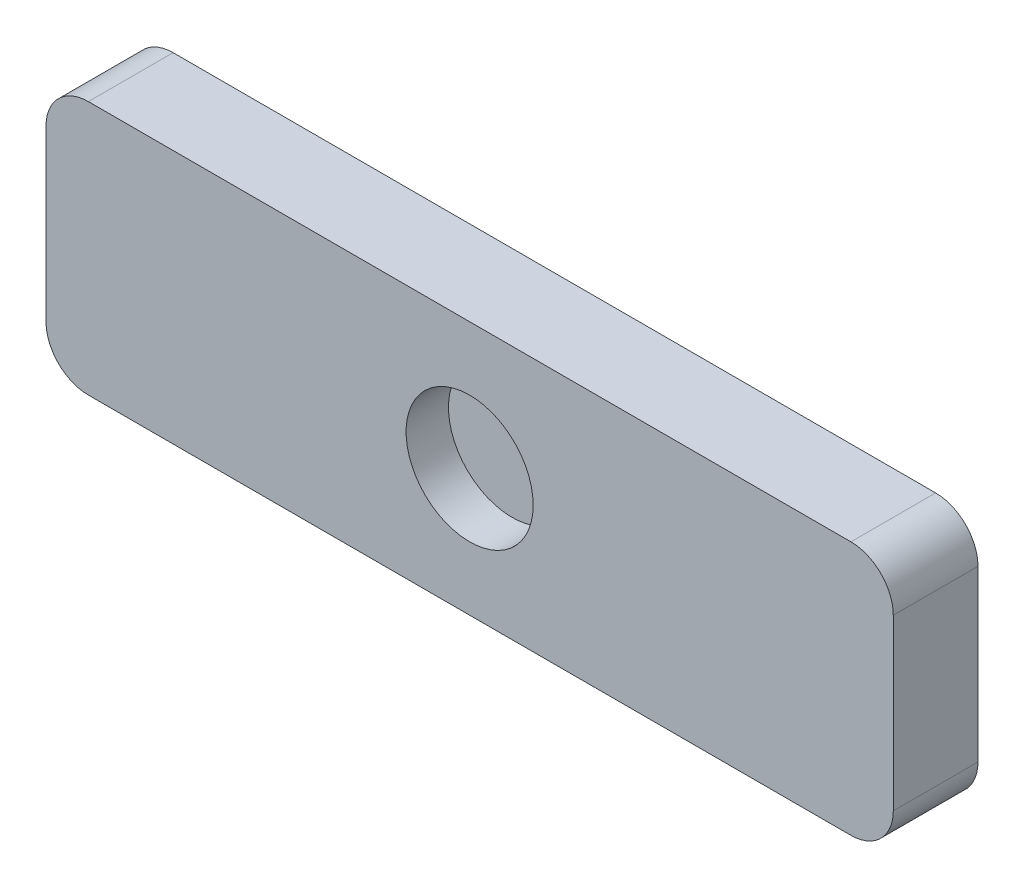
ISO-10303-21;
HEADER;
FILE_DESCRIPTION(('STEP AP214'),'2;1');
FILE_NAME('part.step','',(''),(''),'','','');
FILE_SCHEMA(('AUTOMOTIVE_DESIGN { 1 0 10303 214 1 1 1 1 }'));
ENDSEC;
DATA;
#1=APPLICATION_CONTEXT('core data for automotive mechanical design processes');
#2=APPLICATION_PROTOCOL_DEFINITION('international standard','automotive_design',2000,#1);
#3=PRODUCT_CONTEXT('',#1,'mechanical');
#4=PRODUCT('Part','Part','',(#3));
#5=PRODUCT_RELATED_PRODUCT_CATEGORY('part','',(#4));
#6=PRODUCT_DEFINITION_FORMATION('','',#4);
#7=PRODUCT_DEFINITION_CONTEXT('part definition',#1,'design');
#8=PRODUCT_DEFINITION('design','',#6,#7);
#9=PRODUCT_DEFINITION_SHAPE('','',#8);
#10=(LENGTH_UNIT() NAMED_UNIT(*) SI_UNIT(.MILLI.,.METRE.));
#11=(NAMED_UNIT(*) PLANE_ANGLE_UNIT() SI_UNIT($,.RADIAN.));
#12=(NAMED_UNIT(*) SI_UNIT($,.STERADIAN.) SOLID_ANGLE_UNIT());
#13=UNCERTAINTY_MEASURE_WITH_UNIT(LENGTH_MEASURE(1.E-05),#10,'distance_accuracy_value','');
#14=(GEOMETRIC_REPRESENTATION_CONTEXT(3) GLOBAL_UNCERTAINTY_ASSIGNED_CONTEXT((#13)) GLOBAL_UNIT_ASSIGNED_CONTEXT((#10,
#11,#12)) REPRESENTATION_CONTEXT('',''));
#15=CARTESIAN_POINT('',(0.,0.,0.));
#16=DIRECTION('',(0.,0.,1.));
#17=DIRECTION('',(1.,0.,0.));
#18=AXIS2_PLACEMENT_3D('',#15,#16,#17);
#19=CARTESIAN_POINT('',(5000.,-1500.,1000.));
#20=DIRECTION('',(-1.,0.,0.));
#21=DIRECTION('',(0.,0.,1.));
#22=AXIS2_PLACEMENT_3D('',#19,#20,#21);
#23=PLANE('',#22);
#24=DIRECTION('',(0.,1.,0.));
#25=VECTOR('',#24,1.);
#26=CARTESIAN_POINT('',(5000.,-1500.,1000.));
#27=LINE('',#26,#25);
#28=CARTESIAN_POINT('',(5000.,-1000.,1000.));
#29=VERTEX_POINT('',#28);
#30=CARTESIAN_POINT('',(5000.,999.999999999999,1000.));
#31=VERTEX_POINT('',#30);
#32=EDGE_CURVE('E128',#29,#31,#27,.T.);
#33=ORIENTED_EDGE('',*,*,#32,.F.);
#34=DIRECTION('',(0.,0.,-1.));
#35=VECTOR('',#34,1.);
#36=CARTESIAN_POINT('',(5000.,-1000.,1000.));
#37=LINE('',#36,#35);
#38=CARTESIAN_POINT('',(5000.,-1000.,0.));
#39=VERTEX_POINT('',#38);
#40=EDGE_CURVE('E40',#29,#39,#37,.T.);
#41=ORIENTED_EDGE('',*,*,#40,.T.);
#42=DIRECTION('',(0.,1.,0.));
#43=VECTOR('',#42,1.);
#44=CARTESIAN_POINT('',(5000.,-1500.,0.));
#45=LINE('',#44,#43);
#46=CARTESIAN_POINT('',(5000.,999.999999999999,0.));
#47=VERTEX_POINT('',#46);
#48=EDGE_CURVE('E130',#39,#47,#45,.T.);
#49=ORIENTED_EDGE('',*,*,#48,.T.);
#50=DIRECTION('',(0.,0.,-1.));
#51=VECTOR('',#50,1.);
#52=CARTESIAN_POINT('',(5000.,1000.,1000.));
#53=LINE('',#52,#51);
#54=EDGE_CURVE('E47',#47,#31,#53,.F.);
#55=ORIENTED_EDGE('',*,*,#54,.T.);
#56=EDGE_LOOP('',(#33,#41,#49,#55));
#57=FACE_BOUND('',#56,.T.);
#58=ADVANCED_FACE('F32',(#57),#23,.F.);
#59=CARTESIAN_POINT('',(-5000.,1500.,1000.));
#60=DIRECTION('',(0.,-1.,0.));
#61=DIRECTION('',(0.,0.,-1.));
#62=AXIS2_PLACEMENT_3D('',#59,#60,#61);
#63=PLANE('',#62);
#64=DIRECTION('',(-1.,0.,0.));
#65=VECTOR('',#64,1.);
#66=CARTESIAN_POINT('',(-5000.,1500.,1000.));
#67=LINE('',#66,#65);
#68=CARTESIAN_POINT('',(4500.,1500.,1000.));
#69=VERTEX_POINT('',#68);
#70=CARTESIAN_POINT('',(-4500.,1500.,1000.));
#71=VERTEX_POINT('',#70);
#72=EDGE_CURVE('E165',#69,#71,#67,.T.);
#73=ORIENTED_EDGE('',*,*,#72,.F.);
#74=DIRECTION('',(0.,0.,-1.));
#75=VECTOR('',#74,1.);
#76=CARTESIAN_POINT('',(4500.,1500.,1000.));
#77=LINE('',#76,#75);
#78=CARTESIAN_POINT('',(4500.,1500.,0.));
#79=VERTEX_POINT('',#78);
#80=EDGE_CURVE('E11',#69,#79,#77,.T.);
#81=ORIENTED_EDGE('',*,*,#80,.T.);
#82=DIRECTION('',(-1.,0.,0.));
#83=VECTOR('',#82,1.);
#84=CARTESIAN_POINT('',(-5000.,1500.,0.));
#85=LINE('',#84,#83);
#86=CARTESIAN_POINT('',(-4500.,1500.,0.));
#87=VERTEX_POINT('',#86);
#88=EDGE_CURVE('E125',#79,#87,#85,.T.);
#89=ORIENTED_EDGE('',*,*,#88,.T.);
#90=DIRECTION('',(0.,0.,-1.));
#91=VECTOR('',#90,1.);
#92=CARTESIAN_POINT('',(-4500.,1500.,1000.));
#93=LINE('',#92,#91);
#94=EDGE_CURVE('E106',#87,#71,#93,.F.);
#95=ORIENTED_EDGE('',*,*,#94,.T.);
#96=EDGE_LOOP('',(#73,#81,#89,#95));
#97=FACE_BOUND('',#96,.T.);
#98=ADVANCED_FACE('F193',(#97),#63,.F.);
#99=CARTESIAN_POINT('',(-5000.,-1500.,1000.));
#100=DIRECTION('',(1.,0.,0.));
#101=DIRECTION('',(0.,0.,-1.));
#102=AXIS2_PLACEMENT_3D('',#99,#100,#101);
#103=PLANE('',#102);
#104=DIRECTION('',(0.,-1.,0.));
#105=VECTOR('',#104,1.);
#106=CARTESIAN_POINT('',(-5000.,-1500.,0.));
#107=LINE('',#106,#105);
#108=CARTESIAN_POINT('',(-5000.,999.999999999999,0.));
#109=VERTEX_POINT('',#108);
#110=CARTESIAN_POINT('',(-5000.,-1000.,0.));
#111=VERTEX_POINT('',#110);
#112=EDGE_CURVE('E115',#109,#111,#107,.T.);
#113=ORIENTED_EDGE('',*,*,#112,.T.);
#114=DIRECTION('',(0.,0.,-1.));
#115=VECTOR('',#114,1.);
#116=CARTESIAN_POINT('',(-5000.,-1000.,1000.));
#117=LINE('',#116,#115);
#118=CARTESIAN_POINT('',(-5000.,-1000.,1000.));
#119=VERTEX_POINT('',#118);
#120=EDGE_CURVE('E147',#111,#119,#117,.F.);
#121=ORIENTED_EDGE('',*,*,#120,.T.);
#122=DIRECTION('',(0.,-1.,0.));
#123=VECTOR('',#122,1.);
#124=CARTESIAN_POINT('',(-5000.,-1500.,1000.));
#125=LINE('',#124,#123);
#126=CARTESIAN_POINT('',(-5000.,999.999999999999,1000.));
#127=VERTEX_POINT('',#126);
#128=EDGE_CURVE('E118',#127,#119,#125,.T.);
#129=ORIENTED_EDGE('',*,*,#128,.F.);
#130=DIRECTION('',(0.,0.,-1.));
#131=VECTOR('',#130,1.);
#132=CARTESIAN_POINT('',(-5000.,1000.,1000.));
#133=LINE('',#132,#131);
#134=EDGE_CURVE('E104',#127,#109,#133,.T.);
#135=ORIENTED_EDGE('',*,*,#134,.T.);
#136=EDGE_LOOP('',(#113,#121,#129,#135));
#137=FACE_BOUND('',#136,.T.);
#138=ADVANCED_FACE('F114',(#137),#103,.F.);
#139=CARTESIAN_POINT('',(-5000.,-1500.,1000.));
#140=DIRECTION('',(0.,1.,0.));
#141=DIRECTION('',(0.,0.,1.));
#142=AXIS2_PLACEMENT_3D('',#139,#140,#141);
#143=PLANE('',#142);
#144=DIRECTION('',(1.,0.,0.));
#145=VECTOR('',#144,1.);
#146=CARTESIAN_POINT('',(-5000.,-1500.,1000.));
#147=LINE('',#146,#145);
#148=CARTESIAN_POINT('',(-4500.,-1500.,1000.));
#149=VERTEX_POINT('',#148);
#150=CARTESIAN_POINT('',(4500.,-1500.,1000.));
#151=VERTEX_POINT('',#150);
#152=EDGE_CURVE('E119',#149,#151,#147,.T.);
#153=ORIENTED_EDGE('',*,*,#152,.F.);
#154=DIRECTION('',(0.,0.,-1.));
#155=VECTOR('',#154,1.);
#156=CARTESIAN_POINT('',(-4500.,-1500.,1000.));
#157=LINE('',#156,#155);
#158=CARTESIAN_POINT('',(-4500.,-1500.,0.));
#159=VERTEX_POINT('',#158);
#160=EDGE_CURVE('E139',#149,#159,#157,.T.);
#161=ORIENTED_EDGE('',*,*,#160,.T.);
#162=DIRECTION('',(1.,0.,0.));
#163=VECTOR('',#162,1.);
#164=CARTESIAN_POINT('',(-5000.,-1500.,0.));
#165=LINE('',#164,#163);
#166=CARTESIAN_POINT('',(4500.,-1500.,0.));
#167=VERTEX_POINT('',#166);
#168=EDGE_CURVE('E124',#159,#167,#165,.T.);
#169=ORIENTED_EDGE('',*,*,#168,.T.);
#170=DIRECTION('',(0.,0.,-1.));
#171=VECTOR('',#170,1.);
#172=CARTESIAN_POINT('',(4500.,-1500.,1000.));
#173=LINE('',#172,#171);
#174=EDGE_CURVE('E137',#167,#151,#173,.F.);
#175=ORIENTED_EDGE('',*,*,#174,.T.);
#176=EDGE_LOOP('',(#153,#161,#169,#175));
#177=FACE_BOUND('',#176,.T.);
#178=ADVANCED_FACE('F175',(#177),#143,.F.);
#179=CARTESIAN_POINT('',(0.,0.,1000.));
#180=DIRECTION('',(0.,0.,-1.));
#181=DIRECTION('',(-1.,0.,0.));
#182=AXIS2_PLACEMENT_3D('',#179,#180,#181);
#183=PLANE('',#182);
#184=CARTESIAN_POINT('',(0.,0.,1000.));
#185=DIRECTION('',(0.,0.,1.));
#186=DIRECTION('',(1.,0.,0.));
#187=AXIS2_PLACEMENT_3D('',#184,#185,#186);
#188=CIRCLE('',#187,750.);
#189=CARTESIAN_POINT('',(750.,0.,1000.));
#190=VERTEX_POINT('',#189);
#191=EDGE_CURVE('E160',#190,#190,#188,.T.);
#192=ORIENTED_EDGE('',*,*,#191,.F.);
#193=EDGE_LOOP('',(#192));
#194=FACE_BOUND('',#193,.T.);
#195=ORIENTED_EDGE('',*,*,#128,.T.);
#196=CARTESIAN_POINT('',(-4500.,-1000.,1000.));
#197=DIRECTION('',(0.,0.,-1.));
#198=DIRECTION('',(-1.,0.,0.));
#199=AXIS2_PLACEMENT_3D('',#196,#197,#198);
#200=CIRCLE('',#199,500.);
#201=EDGE_CURVE('E152',#119,#149,#200,.F.);
#202=ORIENTED_EDGE('',*,*,#201,.T.);
#203=ORIENTED_EDGE('',*,*,#152,.T.);
#204=CARTESIAN_POINT('',(4500.,-1000.,1000.));
#205=DIRECTION('',(0.,0.,-1.));
#206=DIRECTION('',(-1.,0.,0.));
#207=AXIS2_PLACEMENT_3D('',#204,#205,#206);
#208=CIRCLE('',#207,500.);
#209=EDGE_CURVE('E54',#151,#29,#208,.F.);
#210=ORIENTED_EDGE('',*,*,#209,.T.);
#211=ORIENTED_EDGE('',*,*,#32,.T.);
#212=CARTESIAN_POINT('',(4500.,1000.,1000.));
#213=DIRECTION('',(0.,0.,-1.));
#214=DIRECTION('',(-1.,0.,0.));
#215=AXIS2_PLACEMENT_3D('',#212,#213,#214);
#216=CIRCLE('',#215,500.);
#217=EDGE_CURVE('E149',#31,#69,#216,.F.);
#218=ORIENTED_EDGE('',*,*,#217,.T.);
#219=ORIENTED_EDGE('',*,*,#72,.T.);
#220=CARTESIAN_POINT('',(-4500.,1000.,1000.));
#221=DIRECTION('',(0.,0.,-1.));
#222=DIRECTION('',(-1.,0.,0.));
#223=AXIS2_PLACEMENT_3D('',#220,#221,#222);
#224=CIRCLE('',#223,500.);
#225=EDGE_CURVE('E135',#71,#127,#224,.F.);
#226=ORIENTED_EDGE('',*,*,#225,.T.);
#227=EDGE_LOOP('',(#195,#202,#203,#210,#211,#218,#219,#226));
#228=FACE_BOUND('',#227,.T.);
#229=ADVANCED_FACE('F173',(#194,#228),#183,.F.);
#230=CARTESIAN_POINT('',(0.,0.,0.));
#231=DIRECTION('',(0.,0.,-1.));
#232=DIRECTION('',(-1.,0.,0.));
#233=AXIS2_PLACEMENT_3D('',#230,#231,#232);
#234=PLANE('',#233);
#235=ORIENTED_EDGE('',*,*,#168,.F.);
#236=CARTESIAN_POINT('',(-4500.,-1000.,0.));
#237=DIRECTION('',(0.,0.,-1.));
#238=DIRECTION('',(-1.,0.,0.));
#239=AXIS2_PLACEMENT_3D('',#236,#237,#238);
#240=CIRCLE('',#239,500.);
#241=EDGE_CURVE('E123',#159,#111,#240,.T.);
#242=ORIENTED_EDGE('',*,*,#241,.T.);
#243=ORIENTED_EDGE('',*,*,#112,.F.);
#244=CARTESIAN_POINT('',(-4500.,1000.,0.));
#245=DIRECTION('',(0.,0.,-1.));
#246=DIRECTION('',(-1.,0.,0.));
#247=AXIS2_PLACEMENT_3D('',#244,#245,#246);
#248=CIRCLE('',#247,500.);
#249=EDGE_CURVE('E100',#109,#87,#248,.T.);
#250=ORIENTED_EDGE('',*,*,#249,.T.);
#251=ORIENTED_EDGE('',*,*,#88,.F.);
#252=CARTESIAN_POINT('',(4500.,1000.,0.));
#253=DIRECTION('',(0.,0.,-1.));
#254=DIRECTION('',(-1.,0.,0.));
#255=AXIS2_PLACEMENT_3D('',#252,#253,#254);
#256=CIRCLE('',#255,500.);
#257=EDGE_CURVE('E142',#79,#47,#256,.T.);
#258=ORIENTED_EDGE('',*,*,#257,.T.);
#259=ORIENTED_EDGE('',*,*,#48,.F.);
#260=CARTESIAN_POINT('',(4500.,-1000.,0.));
#261=DIRECTION('',(0.,0.,-1.));
#262=DIRECTION('',(-1.,0.,0.));
#263=AXIS2_PLACEMENT_3D('',#260,#261,#262);
#264=CIRCLE('',#263,500.);
#265=EDGE_CURVE('E144',#39,#167,#264,.T.);
#266=ORIENTED_EDGE('',*,*,#265,.T.);
#267=EDGE_LOOP('',(#235,#242,#243,#250,#251,#258,#259,#266));
#268=FACE_BOUND('',#267,.T.);
#269=ADVANCED_FACE('F122',(#268),#234,.T.);
#270=CARTESIAN_POINT('',(-4500.,1000.,1000.));
#271=DIRECTION('',(0.,0.,-1.));
#272=DIRECTION('',(-1.,0.,0.));
#273=AXIS2_PLACEMENT_3D('',#270,#271,#272);
#274=CYLINDRICAL_SURFACE('',#273,500.);
#275=ORIENTED_EDGE('',*,*,#225,.F.);
#276=ORIENTED_EDGE('',*,*,#94,.F.);
#277=ORIENTED_EDGE('',*,*,#249,.F.);
#278=ORIENTED_EDGE('',*,*,#134,.F.);
#279=EDGE_LOOP('',(#275,#276,#277,#278));
#280=FACE_BOUND('',#279,.T.);
#281=ADVANCED_FACE('F103',(#280),#274,.T.);
#282=CARTESIAN_POINT('',(-4500.,-1000.,1000.));
#283=DIRECTION('',(0.,0.,-1.));
#284=DIRECTION('',(-1.,0.,0.));
#285=AXIS2_PLACEMENT_3D('',#282,#283,#284);
#286=CYLINDRICAL_SURFACE('',#285,500.);
#287=ORIENTED_EDGE('',*,*,#201,.F.);
#288=ORIENTED_EDGE('',*,*,#120,.F.);
#289=ORIENTED_EDGE('',*,*,#241,.F.);
#290=ORIENTED_EDGE('',*,*,#160,.F.);
#291=EDGE_LOOP('',(#287,#288,#289,#290));
#292=FACE_BOUND('',#291,.T.);
#293=ADVANCED_FACE('F181',(#292),#286,.T.);
#294=CARTESIAN_POINT('',(4500.,-1000.,1000.));
#295=DIRECTION('',(0.,0.,-1.));
#296=DIRECTION('',(-1.,0.,0.));
#297=AXIS2_PLACEMENT_3D('',#294,#295,#296);
#298=CYLINDRICAL_SURFACE('',#297,500.);
#299=ORIENTED_EDGE('',*,*,#209,.F.);
#300=ORIENTED_EDGE('',*,*,#174,.F.);
#301=ORIENTED_EDGE('',*,*,#265,.F.);
#302=ORIENTED_EDGE('',*,*,#40,.F.);
#303=EDGE_LOOP('',(#299,#300,#301,#302));
#304=FACE_BOUND('',#303,.T.);
#305=ADVANCED_FACE('F184',(#304),#298,.T.);
#306=CARTESIAN_POINT('',(4500.,1000.,1000.));
#307=DIRECTION('',(0.,0.,-1.));
#308=DIRECTION('',(-1.,0.,0.));
#309=AXIS2_PLACEMENT_3D('',#306,#307,#308);
#310=CYLINDRICAL_SURFACE('',#309,500.);
#311=ORIENTED_EDGE('',*,*,#217,.F.);
#312=ORIENTED_EDGE('',*,*,#54,.F.);
#313=ORIENTED_EDGE('',*,*,#257,.F.);
#314=ORIENTED_EDGE('',*,*,#80,.F.);
#315=EDGE_LOOP('',(#311,#312,#313,#314));
#316=FACE_BOUND('',#315,.T.);
#317=ADVANCED_FACE('F34',(#316),#310,.T.);
#318=CARTESIAN_POINT('',(0.,0.,500.));
#319=DIRECTION('',(0.,0.,1.));
#320=DIRECTION('',(1.,0.,0.));
#321=AXIS2_PLACEMENT_3D('',#318,#319,#320);
#322=CYLINDRICAL_SURFACE('',#321,750.);
#323=CARTESIAN_POINT('',(0.,0.,500.));
#324=DIRECTION('',(0.,0.,1.));
#325=DIRECTION('',(1.,0.,0.));
#326=AXIS2_PLACEMENT_3D('',#323,#324,#325);
#327=CIRCLE('',#326,750.);
#328=CARTESIAN_POINT('',(750.,0.,500.));
#329=VERTEX_POINT('',#328);
#330=EDGE_CURVE('E158',#329,#329,#327,.T.);
#331=ORIENTED_EDGE('',*,*,#330,.F.);
#332=EDGE_LOOP('',(#331));
#333=FACE_BOUND('',#332,.T.);
#334=ORIENTED_EDGE('',*,*,#191,.T.);
#335=EDGE_LOOP('',(#334));
#336=FACE_BOUND('',#335,.T.);
#337=ADVANCED_FACE('F171',(#333,#336),#322,.F.);
#338=CARTESIAN_POINT('',(0.,0.,500.));
#339=DIRECTION('',(0.,0.,1.));
#340=DIRECTION('',(1.,0.,0.));
#341=AXIS2_PLACEMENT_3D('',#338,#339,#340);
#342=PLANE('',#341);
#343=ORIENTED_EDGE('',*,*,#330,.T.);
#344=EDGE_LOOP('',(#343));
#345=FACE_BOUND('',#344,.T.);
#346=ADVANCED_FACE('F238',(#345),#342,.T.);
#347=CLOSED_SHELL('',(#58,#98,#138,#178,#229,#269,#281,#293,#305,#317,#337,#346));
#348=MANIFOLD_SOLID_BREP('B2',#347);
#349=ADVANCED_BREP_SHAPE_REPRESENTATION('',(#18,#348),#14);
#350=SHAPE_DEFINITION_REPRESENTATION(#9,#349);
ENDSEC;
END-ISO-10303-21;
